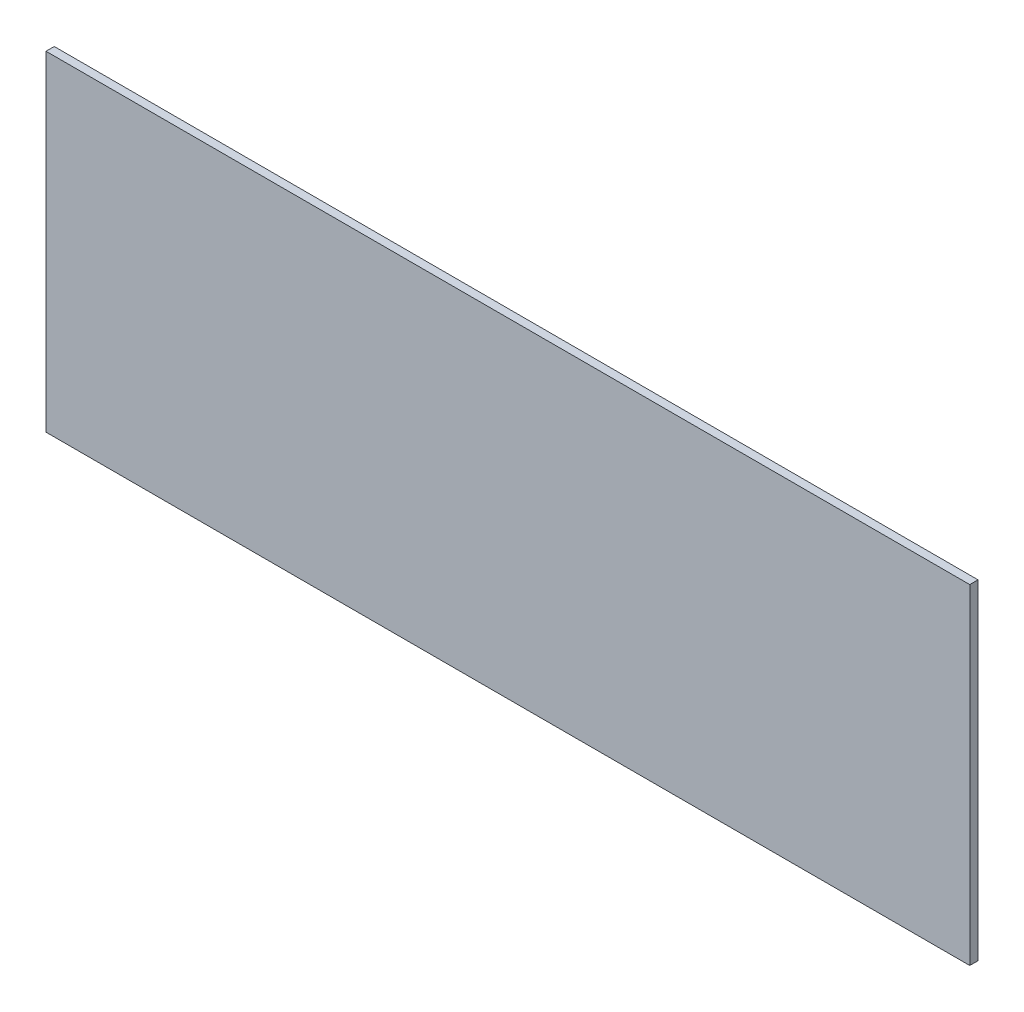
ISO-10303-21;
HEADER;
FILE_DESCRIPTION(('STEP AP214'),'2;1');
FILE_NAME('part.step','',(''),(''),'','','');
FILE_SCHEMA(('AUTOMOTIVE_DESIGN { 1 0 10303 214 1 1 1 1 }'));
ENDSEC;
DATA;
#1=APPLICATION_CONTEXT('core data for automotive mechanical design processes');
#2=APPLICATION_PROTOCOL_DEFINITION('international standard','automotive_design',2000,#1);
#3=PRODUCT_CONTEXT('',#1,'mechanical');
#4=PRODUCT('Part','Part','',(#3));
#5=PRODUCT_RELATED_PRODUCT_CATEGORY('part','',(#4));
#6=PRODUCT_DEFINITION_FORMATION('','',#4);
#7=PRODUCT_DEFINITION_CONTEXT('part definition',#1,'design');
#8=PRODUCT_DEFINITION('design','',#6,#7);
#9=PRODUCT_DEFINITION_SHAPE('','',#8);
#10=(LENGTH_UNIT() NAMED_UNIT(*) SI_UNIT(.MILLI.,.METRE.));
#11=(NAMED_UNIT(*) PLANE_ANGLE_UNIT() SI_UNIT($,.RADIAN.));
#12=(NAMED_UNIT(*) SI_UNIT($,.STERADIAN.) SOLID_ANGLE_UNIT());
#13=UNCERTAINTY_MEASURE_WITH_UNIT(LENGTH_MEASURE(1.E-05),#10,'distance_accuracy_value','');
#14=(GEOMETRIC_REPRESENTATION_CONTEXT(3) GLOBAL_UNCERTAINTY_ASSIGNED_CONTEXT((#13)) GLOBAL_UNIT_ASSIGNED_CONTEXT((#10,
#11,#12)) REPRESENTATION_CONTEXT('',''));
#15=CARTESIAN_POINT('',(0.,0.,0.));
#16=DIRECTION('',(0.,0.,1.));
#17=DIRECTION('',(1.,0.,0.));
#18=AXIS2_PLACEMENT_3D('',#15,#16,#17);
#19=CARTESIAN_POINT('',(0.,0.,2.5));
#20=DIRECTION('',(1.,0.,0.));
#21=DIRECTION('',(0.,0.,-1.));
#22=AXIS2_PLACEMENT_3D('',#19,#20,#21);
#23=PLANE('',#22);
#24=DIRECTION('',(0.,-1.,0.));
#25=VECTOR('',#24,1.);
#26=CARTESIAN_POINT('',(0.,0.,0.));
#27=LINE('',#26,#25);
#28=CARTESIAN_POINT('',(0.,100.,0.));
#29=VERTEX_POINT('',#28);
#30=CARTESIAN_POINT('',(0.,0.,0.));
#31=VERTEX_POINT('',#30);
#32=EDGE_CURVE('E100',#29,#31,#27,.T.);
#33=ORIENTED_EDGE('',*,*,#32,.T.);
#34=DIRECTION('',(0.,0.,-1.));
#35=VECTOR('',#34,1.);
#36=CARTESIAN_POINT('',(0.,0.,2.5));
#37=LINE('',#36,#35);
#38=CARTESIAN_POINT('',(0.,0.,2.5));
#39=VERTEX_POINT('',#38);
#40=EDGE_CURVE('E11',#39,#31,#37,.T.);
#41=ORIENTED_EDGE('',*,*,#40,.F.);
#42=DIRECTION('',(0.,-1.,0.));
#43=VECTOR('',#42,1.);
#44=CARTESIAN_POINT('',(0.,0.,2.5));
#45=LINE('',#44,#43);
#46=CARTESIAN_POINT('',(0.,100.,2.5));
#47=VERTEX_POINT('',#46);
#48=EDGE_CURVE('E88',#47,#39,#45,.T.);
#49=ORIENTED_EDGE('',*,*,#48,.F.);
#50=DIRECTION('',(0.,0.,-1.));
#51=VECTOR('',#50,1.);
#52=CARTESIAN_POINT('',(0.,100.,2.5));
#53=LINE('',#52,#51);
#54=EDGE_CURVE('E96',#47,#29,#53,.T.);
#55=ORIENTED_EDGE('',*,*,#54,.T.);
#56=EDGE_LOOP('',(#33,#41,#49,#55));
#57=FACE_BOUND('',#56,.T.);
#58=ADVANCED_FACE('F37',(#57),#23,.F.);
#59=CARTESIAN_POINT('',(0.,0.,2.5));
#60=DIRECTION('',(0.,1.,0.));
#61=DIRECTION('',(0.,0.,1.));
#62=AXIS2_PLACEMENT_3D('',#59,#60,#61);
#63=PLANE('',#62);
#64=DIRECTION('',(1.,0.,0.));
#65=VECTOR('',#64,1.);
#66=CARTESIAN_POINT('',(0.,0.,0.));
#67=LINE('',#66,#65);
#68=CARTESIAN_POINT('',(280.,0.,0.));
#69=VERTEX_POINT('',#68);
#70=EDGE_CURVE('E92',#31,#69,#67,.T.);
#71=ORIENTED_EDGE('',*,*,#70,.T.);
#72=DIRECTION('',(0.,0.,-1.));
#73=VECTOR('',#72,1.);
#74=CARTESIAN_POINT('',(280.,0.,2.5));
#75=LINE('',#74,#73);
#76=CARTESIAN_POINT('',(280.,0.,2.5));
#77=VERTEX_POINT('',#76);
#78=EDGE_CURVE('E45',#77,#69,#75,.T.);
#79=ORIENTED_EDGE('',*,*,#78,.F.);
#80=DIRECTION('',(1.,0.,0.));
#81=VECTOR('',#80,1.);
#82=CARTESIAN_POINT('',(0.,0.,2.5));
#83=LINE('',#82,#81);
#84=EDGE_CURVE('E83',#39,#77,#83,.T.);
#85=ORIENTED_EDGE('',*,*,#84,.F.);
#86=ORIENTED_EDGE('',*,*,#40,.T.);
#87=EDGE_LOOP('',(#71,#79,#85,#86));
#88=FACE_BOUND('',#87,.T.);
#89=ADVANCED_FACE('F91',(#88),#63,.F.);
#90=CARTESIAN_POINT('',(280.,0.,2.5));
#91=DIRECTION('',(-1.,0.,0.));
#92=DIRECTION('',(0.,0.,1.));
#93=AXIS2_PLACEMENT_3D('',#90,#91,#92);
#94=PLANE('',#93);
#95=DIRECTION('',(0.,1.,0.));
#96=VECTOR('',#95,1.);
#97=CARTESIAN_POINT('',(280.,0.,0.));
#98=LINE('',#97,#96);
#99=CARTESIAN_POINT('',(280.,100.,0.));
#100=VERTEX_POINT('',#99);
#101=EDGE_CURVE('E70',#69,#100,#98,.T.);
#102=ORIENTED_EDGE('',*,*,#101,.T.);
#103=DIRECTION('',(0.,0.,-1.));
#104=VECTOR('',#103,1.);
#105=CARTESIAN_POINT('',(280.,100.,2.5));
#106=LINE('',#105,#104);
#107=CARTESIAN_POINT('',(280.,100.,2.5));
#108=VERTEX_POINT('',#107);
#109=EDGE_CURVE('E93',#108,#100,#106,.T.);
#110=ORIENTED_EDGE('',*,*,#109,.F.);
#111=DIRECTION('',(0.,1.,0.));
#112=VECTOR('',#111,1.);
#113=CARTESIAN_POINT('',(280.,0.,2.5));
#114=LINE('',#113,#112);
#115=EDGE_CURVE('E86',#77,#108,#114,.T.);
#116=ORIENTED_EDGE('',*,*,#115,.F.);
#117=ORIENTED_EDGE('',*,*,#78,.T.);
#118=EDGE_LOOP('',(#102,#110,#116,#117));
#119=FACE_BOUND('',#118,.T.);
#120=ADVANCED_FACE('F94',(#119),#94,.F.);
#121=CARTESIAN_POINT('',(0.,100.,2.5));
#122=DIRECTION('',(0.,-1.,0.));
#123=DIRECTION('',(0.,0.,-1.));
#124=AXIS2_PLACEMENT_3D('',#121,#122,#123);
#125=PLANE('',#124);
#126=DIRECTION('',(-1.,0.,0.));
#127=VECTOR('',#126,1.);
#128=CARTESIAN_POINT('',(0.,100.,0.));
#129=LINE('',#128,#127);
#130=EDGE_CURVE('E76',#100,#29,#129,.T.);
#131=ORIENTED_EDGE('',*,*,#130,.T.);
#132=ORIENTED_EDGE('',*,*,#54,.F.);
#133=DIRECTION('',(-1.,0.,0.));
#134=VECTOR('',#133,1.);
#135=CARTESIAN_POINT('',(0.,100.,2.5));
#136=LINE('',#135,#134);
#137=EDGE_CURVE('E53',#108,#47,#136,.T.);
#138=ORIENTED_EDGE('',*,*,#137,.F.);
#139=ORIENTED_EDGE('',*,*,#109,.T.);
#140=EDGE_LOOP('',(#131,#132,#138,#139));
#141=FACE_BOUND('',#140,.T.);
#142=ADVANCED_FACE('F107',(#141),#125,.F.);
#143=CARTESIAN_POINT('',(0.,0.,2.5));
#144=DIRECTION('',(0.,0.,-1.));
#145=DIRECTION('',(-1.,0.,0.));
#146=AXIS2_PLACEMENT_3D('',#143,#144,#145);
#147=PLANE('',#146);
#148=ORIENTED_EDGE('',*,*,#48,.T.);
#149=ORIENTED_EDGE('',*,*,#84,.T.);
#150=ORIENTED_EDGE('',*,*,#115,.T.);
#151=ORIENTED_EDGE('',*,*,#137,.T.);
#152=EDGE_LOOP('',(#148,#149,#150,#151));
#153=FACE_BOUND('',#152,.T.);
#154=ADVANCED_FACE('F84',(#153),#147,.F.);
#155=CARTESIAN_POINT('',(0.,0.,0.));
#156=DIRECTION('',(0.,0.,-1.));
#157=DIRECTION('',(-1.,0.,0.));
#158=AXIS2_PLACEMENT_3D('',#155,#156,#157);
#159=PLANE('',#158);
#160=ORIENTED_EDGE('',*,*,#32,.F.);
#161=ORIENTED_EDGE('',*,*,#130,.F.);
#162=ORIENTED_EDGE('',*,*,#101,.F.);
#163=ORIENTED_EDGE('',*,*,#70,.F.);
#164=EDGE_LOOP('',(#160,#161,#162,#163));
#165=FACE_BOUND('',#164,.T.);
#166=ADVANCED_FACE('F110',(#165),#159,.T.);
#167=CLOSED_SHELL('',(#58,#89,#120,#142,#154,#166));
#168=MANIFOLD_SOLID_BREP('B2',#167);
#169=ADVANCED_BREP_SHAPE_REPRESENTATION('',(#18,#168),#14);
#170=SHAPE_DEFINITION_REPRESENTATION(#9,#169);
ENDSEC;
END-ISO-10303-21;
